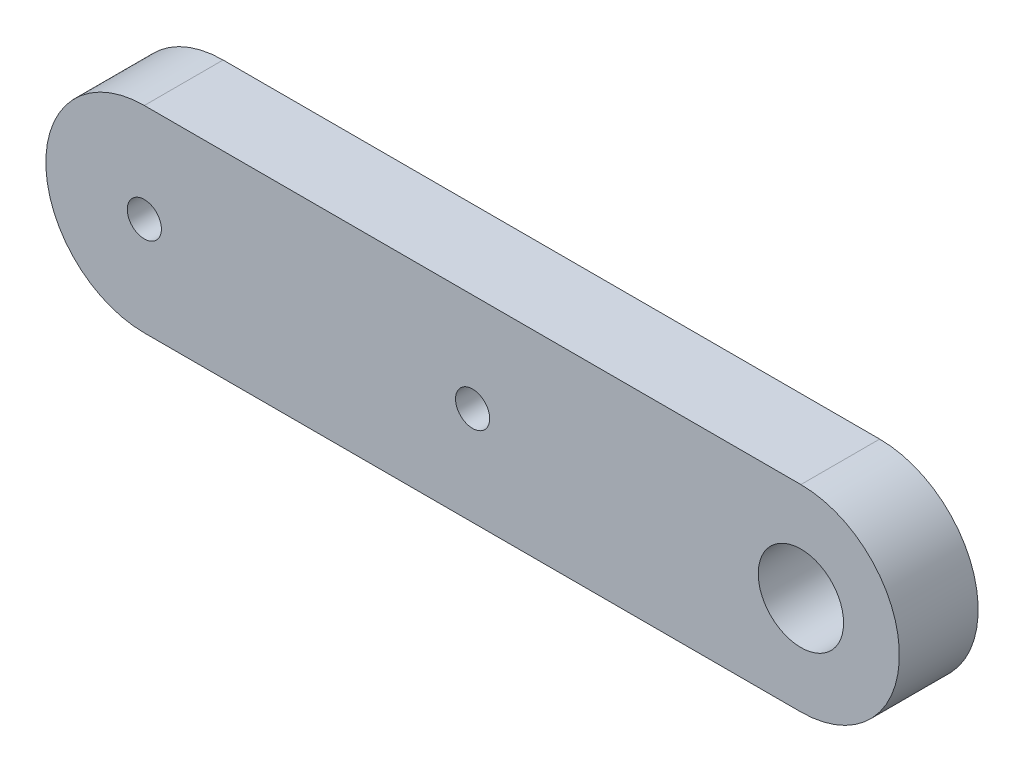
ISO-10303-21;
HEADER;
FILE_DESCRIPTION(('STEP AP214'),'2;1');
FILE_NAME('part.step','',(''),(''),'','','');
FILE_SCHEMA(('AUTOMOTIVE_DESIGN { 1 0 10303 214 1 1 1 1 }'));
ENDSEC;
DATA;
#1=APPLICATION_CONTEXT('core data for automotive mechanical design processes');
#2=APPLICATION_PROTOCOL_DEFINITION('international standard','automotive_design',2000,#1);
#3=PRODUCT_CONTEXT('',#1,'mechanical');
#4=PRODUCT('Part','Part','',(#3));
#5=PRODUCT_RELATED_PRODUCT_CATEGORY('part','',(#4));
#6=PRODUCT_DEFINITION_FORMATION('','',#4);
#7=PRODUCT_DEFINITION_CONTEXT('part definition',#1,'design');
#8=PRODUCT_DEFINITION('design','',#6,#7);
#9=PRODUCT_DEFINITION_SHAPE('','',#8);
#10=(LENGTH_UNIT() NAMED_UNIT(*) SI_UNIT(.MILLI.,.METRE.));
#11=(NAMED_UNIT(*) PLANE_ANGLE_UNIT() SI_UNIT($,.RADIAN.));
#12=(NAMED_UNIT(*) SI_UNIT($,.STERADIAN.) SOLID_ANGLE_UNIT());
#13=UNCERTAINTY_MEASURE_WITH_UNIT(LENGTH_MEASURE(1.E-05),#10,'distance_accuracy_value','');
#14=(GEOMETRIC_REPRESENTATION_CONTEXT(3) GLOBAL_UNCERTAINTY_ASSIGNED_CONTEXT((#13)) GLOBAL_UNIT_ASSIGNED_CONTEXT((#10,
#11,#12)) REPRESENTATION_CONTEXT('',''));
#15=CARTESIAN_POINT('',(0.,0.,0.));
#16=DIRECTION('',(0.,0.,1.));
#17=DIRECTION('',(1.,0.,0.));
#18=AXIS2_PLACEMENT_3D('',#15,#16,#17);
#19=CARTESIAN_POINT('',(0.,-7.5,6.));
#20=DIRECTION('',(0.,-1.,0.));
#21=DIRECTION('',(0.,0.,-1.));
#22=AXIS2_PLACEMENT_3D('',#19,#20,#21);
#23=PLANE('',#22);
#24=DIRECTION('',(-1.,0.,0.));
#25=VECTOR('',#24,1.);
#26=CARTESIAN_POINT('',(0.,-7.5,0.));
#27=LINE('',#26,#25);
#28=CARTESIAN_POINT('',(50.,-7.50000000000001,0.));
#29=VERTEX_POINT('',#28);
#30=CARTESIAN_POINT('',(0.,-7.5,0.));
#31=VERTEX_POINT('',#30);
#32=EDGE_CURVE('E111',#29,#31,#27,.T.);
#33=ORIENTED_EDGE('',*,*,#32,.F.);
#34=DIRECTION('',(0.,0.,-1.));
#35=VECTOR('',#34,1.);
#36=CARTESIAN_POINT('',(50.,-7.50000000000001,6.));
#37=LINE('',#36,#35);
#38=CARTESIAN_POINT('',(50.,-7.50000000000001,6.));
#39=VERTEX_POINT('',#38);
#40=EDGE_CURVE('E11',#39,#29,#37,.T.);
#41=ORIENTED_EDGE('',*,*,#40,.F.);
#42=DIRECTION('',(-1.,0.,0.));
#43=VECTOR('',#42,1.);
#44=CARTESIAN_POINT('',(0.,-7.5,6.));
#45=LINE('',#44,#43);
#46=CARTESIAN_POINT('',(0.,-7.5,6.));
#47=VERTEX_POINT('',#46);
#48=EDGE_CURVE('E92',#39,#47,#45,.T.);
#49=ORIENTED_EDGE('',*,*,#48,.T.);
#50=DIRECTION('',(0.,0.,-1.));
#51=VECTOR('',#50,1.);
#52=CARTESIAN_POINT('',(0.,-7.5,6.));
#53=LINE('',#52,#51);
#54=EDGE_CURVE('E82',#47,#31,#53,.T.);
#55=ORIENTED_EDGE('',*,*,#54,.T.);
#56=EDGE_LOOP('',(#33,#41,#49,#55));
#57=FACE_BOUND('',#56,.T.);
#58=ADVANCED_FACE('F43',(#57),#23,.T.);
#59=CARTESIAN_POINT('',(50.,0.,6.));
#60=DIRECTION('',(0.,0.,-1.));
#61=DIRECTION('',(-1.,0.,0.));
#62=AXIS2_PLACEMENT_3D('',#59,#60,#61);
#63=CYLINDRICAL_SURFACE('',#62,7.50000000000001);
#64=CARTESIAN_POINT('',(50.,0.,0.));
#65=DIRECTION('',(0.,0.,1.));
#66=DIRECTION('',(1.,0.,0.));
#67=AXIS2_PLACEMENT_3D('',#64,#65,#66);
#68=CIRCLE('',#67,7.50000000000001);
#69=CARTESIAN_POINT('',(50.,7.50000000000001,0.));
#70=VERTEX_POINT('',#69);
#71=EDGE_CURVE('E99',#29,#70,#68,.T.);
#72=ORIENTED_EDGE('',*,*,#71,.T.);
#73=DIRECTION('',(0.,0.,-1.));
#74=VECTOR('',#73,1.);
#75=CARTESIAN_POINT('',(50.,7.50000000000001,6.));
#76=LINE('',#75,#74);
#77=CARTESIAN_POINT('',(50.,7.50000000000001,6.));
#78=VERTEX_POINT('',#77);
#79=EDGE_CURVE('E52',#78,#70,#76,.T.);
#80=ORIENTED_EDGE('',*,*,#79,.F.);
#81=CARTESIAN_POINT('',(50.,0.,6.));
#82=DIRECTION('',(0.,0.,1.));
#83=DIRECTION('',(1.,0.,0.));
#84=AXIS2_PLACEMENT_3D('',#81,#82,#83);
#85=CIRCLE('',#84,7.50000000000001);
#86=EDGE_CURVE('E87',#39,#78,#85,.T.);
#87=ORIENTED_EDGE('',*,*,#86,.F.);
#88=ORIENTED_EDGE('',*,*,#40,.T.);
#89=EDGE_LOOP('',(#72,#80,#87,#88));
#90=FACE_BOUND('',#89,.T.);
#91=ADVANCED_FACE('F97',(#90),#63,.T.);
#92=CARTESIAN_POINT('',(0.,7.5,6.));
#93=DIRECTION('',(0.,1.,0.));
#94=DIRECTION('',(0.,0.,1.));
#95=AXIS2_PLACEMENT_3D('',#92,#93,#94);
#96=PLANE('',#95);
#97=DIRECTION('',(1.,0.,0.));
#98=VECTOR('',#97,1.);
#99=CARTESIAN_POINT('',(0.,7.5,0.));
#100=LINE('',#99,#98);
#101=CARTESIAN_POINT('',(0.,7.5,0.));
#102=VERTEX_POINT('',#101);
#103=EDGE_CURVE('E118',#102,#70,#100,.T.);
#104=ORIENTED_EDGE('',*,*,#103,.F.);
#105=DIRECTION('',(0.,0.,-1.));
#106=VECTOR('',#105,1.);
#107=CARTESIAN_POINT('',(0.,7.5,6.));
#108=LINE('',#107,#106);
#109=CARTESIAN_POINT('',(0.,7.5,6.));
#110=VERTEX_POINT('',#109);
#111=EDGE_CURVE('E75',#110,#102,#108,.T.);
#112=ORIENTED_EDGE('',*,*,#111,.F.);
#113=DIRECTION('',(1.,0.,0.));
#114=VECTOR('',#113,1.);
#115=CARTESIAN_POINT('',(0.,7.5,6.));
#116=LINE('',#115,#114);
#117=EDGE_CURVE('E91',#110,#78,#116,.T.);
#118=ORIENTED_EDGE('',*,*,#117,.T.);
#119=ORIENTED_EDGE('',*,*,#79,.T.);
#120=EDGE_LOOP('',(#104,#112,#118,#119));
#121=FACE_BOUND('',#120,.T.);
#122=ADVANCED_FACE('F104',(#121),#96,.T.);
#123=CARTESIAN_POINT('',(0.,0.,6.));
#124=DIRECTION('',(0.,0.,-1.));
#125=DIRECTION('',(-1.,0.,0.));
#126=AXIS2_PLACEMENT_3D('',#123,#124,#125);
#127=CYLINDRICAL_SURFACE('',#126,7.5);
#128=CARTESIAN_POINT('',(0.,0.,0.));
#129=DIRECTION('',(0.,0.,1.));
#130=DIRECTION('',(1.,0.,0.));
#131=AXIS2_PLACEMENT_3D('',#128,#129,#130);
#132=CIRCLE('',#131,7.5);
#133=EDGE_CURVE('E121',#102,#31,#132,.T.);
#134=ORIENTED_EDGE('',*,*,#133,.T.);
#135=ORIENTED_EDGE('',*,*,#54,.F.);
#136=CARTESIAN_POINT('',(0.,0.,6.));
#137=DIRECTION('',(0.,0.,1.));
#138=DIRECTION('',(1.,0.,0.));
#139=AXIS2_PLACEMENT_3D('',#136,#137,#138);
#140=CIRCLE('',#139,7.5);
#141=EDGE_CURVE('E60',#110,#47,#140,.T.);
#142=ORIENTED_EDGE('',*,*,#141,.F.);
#143=ORIENTED_EDGE('',*,*,#111,.T.);
#144=EDGE_LOOP('',(#134,#135,#142,#143));
#145=FACE_BOUND('',#144,.T.);
#146=ADVANCED_FACE('F165',(#145),#127,.T.);
#147=CARTESIAN_POINT('',(0.,0.,6.));
#148=DIRECTION('',(0.,0.,1.));
#149=DIRECTION('',(1.,0.,0.));
#150=AXIS2_PLACEMENT_3D('',#147,#148,#149);
#151=PLANE('',#150);
#152=CARTESIAN_POINT('',(50.,0.,6.));
#153=DIRECTION('',(0.,0.,1.));
#154=DIRECTION('',(1.,0.,0.));
#155=AXIS2_PLACEMENT_3D('',#152,#153,#154);
#156=CIRCLE('',#155,3.25000000000001);
#157=CARTESIAN_POINT('',(53.25,0.,6.));
#158=VERTEX_POINT('',#157);
#159=EDGE_CURVE('E145',#158,#158,#156,.T.);
#160=ORIENTED_EDGE('',*,*,#159,.F.);
#161=EDGE_LOOP('',(#160));
#162=FACE_BOUND('',#161,.T.);
#163=CARTESIAN_POINT('',(25.,0.,6.));
#164=DIRECTION('',(0.,0.,1.));
#165=DIRECTION('',(1.,0.,0.));
#166=AXIS2_PLACEMENT_3D('',#163,#164,#165);
#167=CIRCLE('',#166,1.3);
#168=CARTESIAN_POINT('',(26.3,0.,6.));
#169=VERTEX_POINT('',#168);
#170=EDGE_CURVE('E137',#169,#169,#167,.T.);
#171=ORIENTED_EDGE('',*,*,#170,.F.);
#172=EDGE_LOOP('',(#171));
#173=FACE_BOUND('',#172,.T.);
#174=CARTESIAN_POINT('',(0.,0.,6.));
#175=DIRECTION('',(0.,0.,1.));
#176=DIRECTION('',(1.,0.,0.));
#177=AXIS2_PLACEMENT_3D('',#174,#175,#176);
#178=CIRCLE('',#177,1.3);
#179=CARTESIAN_POINT('',(1.3,0.,6.));
#180=VERTEX_POINT('',#179);
#181=EDGE_CURVE('E129',#180,#180,#178,.T.);
#182=ORIENTED_EDGE('',*,*,#181,.F.);
#183=EDGE_LOOP('',(#182));
#184=FACE_BOUND('',#183,.T.);
#185=ORIENTED_EDGE('',*,*,#48,.F.);
#186=ORIENTED_EDGE('',*,*,#86,.T.);
#187=ORIENTED_EDGE('',*,*,#117,.F.);
#188=ORIENTED_EDGE('',*,*,#141,.T.);
#189=EDGE_LOOP('',(#185,#186,#187,#188));
#190=FACE_BOUND('',#189,.T.);
#191=ADVANCED_FACE('F89',(#162,#173,#184,#190),#151,.T.);
#192=CARTESIAN_POINT('',(0.,0.,0.));
#193=DIRECTION('',(0.,0.,1.));
#194=DIRECTION('',(1.,0.,0.));
#195=AXIS2_PLACEMENT_3D('',#192,#193,#194);
#196=PLANE('',#195);
#197=CARTESIAN_POINT('',(50.,0.,0.));
#198=DIRECTION('',(0.,0.,1.));
#199=DIRECTION('',(1.,0.,0.));
#200=AXIS2_PLACEMENT_3D('',#197,#198,#199);
#201=CIRCLE('',#200,3.25000000000001);
#202=CARTESIAN_POINT('',(53.25,0.,0.));
#203=VERTEX_POINT('',#202);
#204=EDGE_CURVE('E141',#203,#203,#201,.T.);
#205=ORIENTED_EDGE('',*,*,#204,.T.);
#206=EDGE_LOOP('',(#205));
#207=FACE_BOUND('',#206,.T.);
#208=CARTESIAN_POINT('',(25.,0.,0.));
#209=DIRECTION('',(0.,0.,1.));
#210=DIRECTION('',(1.,0.,0.));
#211=AXIS2_PLACEMENT_3D('',#208,#209,#210);
#212=CIRCLE('',#211,1.3);
#213=CARTESIAN_POINT('',(26.3,0.,0.));
#214=VERTEX_POINT('',#213);
#215=EDGE_CURVE('E133',#214,#214,#212,.T.);
#216=ORIENTED_EDGE('',*,*,#215,.T.);
#217=EDGE_LOOP('',(#216));
#218=FACE_BOUND('',#217,.T.);
#219=CARTESIAN_POINT('',(0.,0.,0.));
#220=DIRECTION('',(0.,0.,1.));
#221=DIRECTION('',(1.,0.,0.));
#222=AXIS2_PLACEMENT_3D('',#219,#220,#221);
#223=CIRCLE('',#222,1.3);
#224=CARTESIAN_POINT('',(1.3,0.,0.));
#225=VERTEX_POINT('',#224);
#226=EDGE_CURVE('E115',#225,#225,#223,.T.);
#227=ORIENTED_EDGE('',*,*,#226,.T.);
#228=EDGE_LOOP('',(#227));
#229=FACE_BOUND('',#228,.T.);
#230=ORIENTED_EDGE('',*,*,#32,.T.);
#231=ORIENTED_EDGE('',*,*,#133,.F.);
#232=ORIENTED_EDGE('',*,*,#103,.T.);
#233=ORIENTED_EDGE('',*,*,#71,.F.);
#234=EDGE_LOOP('',(#230,#231,#232,#233));
#235=FACE_BOUND('',#234,.T.);
#236=ADVANCED_FACE('F153',(#207,#218,#229,#235),#196,.F.);
#237=CARTESIAN_POINT('',(0.,0.,0.));
#238=DIRECTION('',(0.,0.,1.));
#239=DIRECTION('',(1.,0.,0.));
#240=AXIS2_PLACEMENT_3D('',#237,#238,#239);
#241=CYLINDRICAL_SURFACE('',#240,1.3);
#242=ORIENTED_EDGE('',*,*,#226,.F.);
#243=EDGE_LOOP('',(#242));
#244=FACE_BOUND('',#243,.T.);
#245=ORIENTED_EDGE('',*,*,#181,.T.);
#246=EDGE_LOOP('',(#245));
#247=FACE_BOUND('',#246,.T.);
#248=ADVANCED_FACE('F171',(#244,#247),#241,.F.);
#249=CARTESIAN_POINT('',(25.,0.,0.));
#250=DIRECTION('',(0.,0.,1.));
#251=DIRECTION('',(1.,0.,0.));
#252=AXIS2_PLACEMENT_3D('',#249,#250,#251);
#253=CYLINDRICAL_SURFACE('',#252,1.3);
#254=ORIENTED_EDGE('',*,*,#215,.F.);
#255=EDGE_LOOP('',(#254));
#256=FACE_BOUND('',#255,.T.);
#257=ORIENTED_EDGE('',*,*,#170,.T.);
#258=EDGE_LOOP('',(#257));
#259=FACE_BOUND('',#258,.T.);
#260=ADVANCED_FACE('F159',(#256,#259),#253,.F.);
#261=CARTESIAN_POINT('',(50.,0.,0.));
#262=DIRECTION('',(0.,0.,1.));
#263=DIRECTION('',(1.,0.,0.));
#264=AXIS2_PLACEMENT_3D('',#261,#262,#263);
#265=CYLINDRICAL_SURFACE('',#264,3.25000000000001);
#266=ORIENTED_EDGE('',*,*,#204,.F.);
#267=EDGE_LOOP('',(#266));
#268=FACE_BOUND('',#267,.T.);
#269=ORIENTED_EDGE('',*,*,#159,.T.);
#270=EDGE_LOOP('',(#269));
#271=FACE_BOUND('',#270,.T.);
#272=ADVANCED_FACE('F156',(#268,#271),#265,.F.);
#273=CLOSED_SHELL('',(#58,#91,#122,#146,#191,#236,#248,#260,#272));
#274=MANIFOLD_SOLID_BREP('B2',#273);
#275=ADVANCED_BREP_SHAPE_REPRESENTATION('',(#18,#274),#14);
#276=SHAPE_DEFINITION_REPRESENTATION(#9,#275);
ENDSEC;
END-ISO-10303-21;
